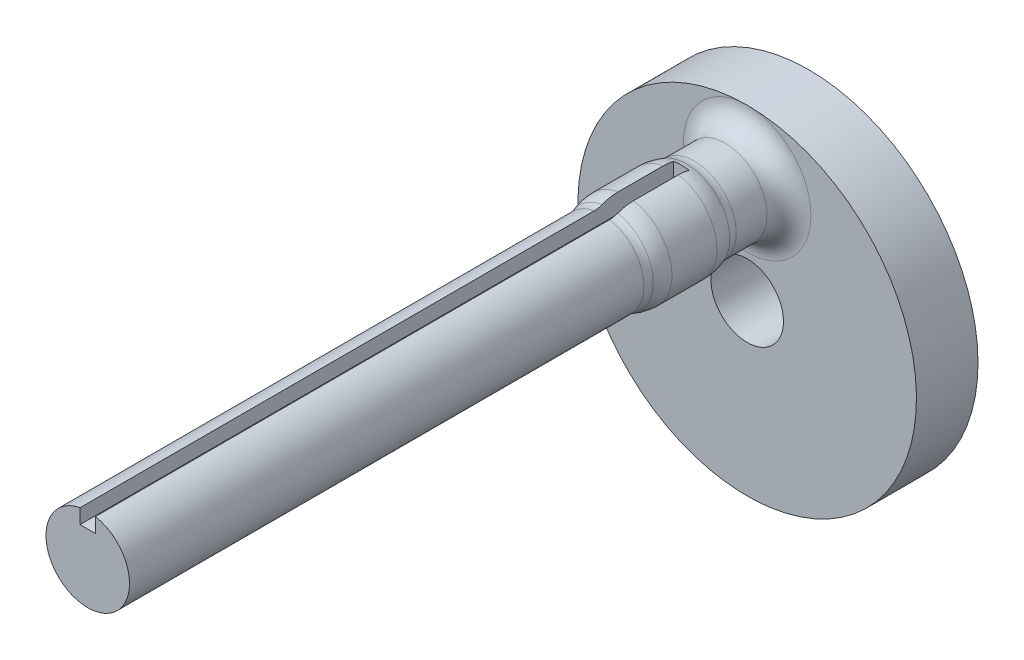
ISO-10303-21;
HEADER;
FILE_DESCRIPTION(('STEP AP214'),'2;1');
FILE_NAME('part.step','',(''),(''),'','','');
FILE_SCHEMA(('AUTOMOTIVE_DESIGN { 1 0 10303 214 1 1 1 1 }'));
ENDSEC;
DATA;
#1=APPLICATION_CONTEXT('core data for automotive mechanical design processes');
#2=APPLICATION_PROTOCOL_DEFINITION('international standard','automotive_design',2000,#1);
#3=PRODUCT_CONTEXT('',#1,'mechanical');
#4=PRODUCT('Part','Part','',(#3));
#5=PRODUCT_RELATED_PRODUCT_CATEGORY('part','',(#4));
#6=PRODUCT_DEFINITION_FORMATION('','',#4);
#7=PRODUCT_DEFINITION_CONTEXT('part definition',#1,'design');
#8=PRODUCT_DEFINITION('design','',#6,#7);
#9=PRODUCT_DEFINITION_SHAPE('','',#8);
#10=(LENGTH_UNIT() NAMED_UNIT(*) SI_UNIT(.MILLI.,.METRE.));
#11=(NAMED_UNIT(*) PLANE_ANGLE_UNIT() SI_UNIT($,.RADIAN.));
#12=(NAMED_UNIT(*) SI_UNIT($,.STERADIAN.) SOLID_ANGLE_UNIT());
#13=UNCERTAINTY_MEASURE_WITH_UNIT(LENGTH_MEASURE(1.E-05),#10,'distance_accuracy_value','');
#14=(GEOMETRIC_REPRESENTATION_CONTEXT(3) GLOBAL_UNCERTAINTY_ASSIGNED_CONTEXT((#13)) GLOBAL_UNIT_ASSIGNED_CONTEXT((#10,
#11,#12)) REPRESENTATION_CONTEXT('',''));
#15=CARTESIAN_POINT('',(0.,0.,0.));
#16=DIRECTION('',(0.,0.,1.));
#17=DIRECTION('',(1.,0.,0.));
#18=AXIS2_PLACEMENT_3D('',#15,#16,#17);
#19=CARTESIAN_POINT('',(0.,4.8,8.8));
#20=DIRECTION('',(0.,0.,-1.));
#21=DIRECTION('',(-1.,0.,0.));
#22=AXIS2_PLACEMENT_3D('',#19,#20,#21);
#23=CYLINDRICAL_SURFACE('',#22,2.1);
#24=DIRECTION('',(0.,0.,-1.));
#25=VECTOR('',#24,1.);
#26=CARTESIAN_POINT('',(-0.35,6.87062792408486,8.8));
#27=LINE('',#26,#25);
#28=CARTESIAN_POINT('',(-0.35,6.87062792408486,6.27703296142691));
#29=VERTEX_POINT('',#28);
#30=CARTESIAN_POINT('',(-0.35,6.87062792408487,8.3229670385731));
#31=VERTEX_POINT('',#30);
#32=EDGE_CURVE('E194',#29,#31,#27,.F.);
#33=ORIENTED_EDGE('',*,*,#32,.F.);
#34=CARTESIAN_POINT('',(0.,4.8,6.27703296142691));
#35=DIRECTION('',(0.,0.,-1.));
#36=DIRECTION('',(-1.,0.,0.));
#37=AXIS2_PLACEMENT_3D('',#34,#35,#36);
#38=CIRCLE('',#37,2.1);
#39=CARTESIAN_POINT('',(0.35,6.87062792408486,6.27703296142691));
#40=VERTEX_POINT('',#39);
#41=EDGE_CURVE('E219',#29,#40,#38,.F.);
#42=ORIENTED_EDGE('',*,*,#41,.T.);
#43=DIRECTION('',(0.,0.,-1.));
#44=VECTOR('',#43,1.);
#45=CARTESIAN_POINT('',(0.35,6.87062792408486,8.8));
#46=LINE('',#45,#44);
#47=CARTESIAN_POINT('',(0.35,6.87062792408487,8.3229670385731));
#48=VERTEX_POINT('',#47);
#49=EDGE_CURVE('E173',#48,#40,#46,.T.);
#50=ORIENTED_EDGE('',*,*,#49,.F.);
#51=CARTESIAN_POINT('',(0.,4.8,8.3229670385731));
#52=DIRECTION('',(0.,0.,-1.));
#53=DIRECTION('',(-1.,0.,0.));
#54=AXIS2_PLACEMENT_3D('',#51,#52,#53);
#55=CIRCLE('',#54,2.1);
#56=EDGE_CURVE('E224',#48,#31,#55,.T.);
#57=ORIENTED_EDGE('',*,*,#56,.T.);
#58=EDGE_LOOP('',(#33,#42,#50,#57));
#59=FACE_BOUND('',#58,.T.);
#60=ADVANCED_FACE('F35',(#59),#23,.T.);
#61=CARTESIAN_POINT('',(0.,4.8,32.8));
#62=DIRECTION('',(0.,0.,1.));
#63=DIRECTION('',(1.,0.,0.));
#64=AXIS2_PLACEMENT_3D('',#61,#62,#63);
#65=PLANE('',#64);
#66=DIRECTION('',(1.,0.,0.));
#67=VECTOR('',#66,1.);
#68=CARTESIAN_POINT('',(-0.35,6.,32.8));
#69=LINE('',#68,#67);
#70=CARTESIAN_POINT('',(-0.35,6.,32.8));
#71=VERTEX_POINT('',#70);
#72=CARTESIAN_POINT('',(0.35,6.,32.8));
#73=VERTEX_POINT('',#72);
#74=EDGE_CURVE('E113',#71,#73,#69,.T.);
#75=ORIENTED_EDGE('',*,*,#74,.F.);
#76=DIRECTION('',(0.,-1.,0.));
#77=VECTOR('',#76,1.);
#78=CARTESIAN_POINT('',(-0.35,6.,32.8));
#79=LINE('',#78,#77);
#80=CARTESIAN_POINT('',(-0.35,6.66748493969831,32.8));
#81=VERTEX_POINT('',#80);
#82=EDGE_CURVE('E102',#81,#71,#79,.T.);
#83=ORIENTED_EDGE('',*,*,#82,.F.);
#84=CARTESIAN_POINT('',(0.,4.8,32.8));
#85=DIRECTION('',(0.,0.,1.));
#86=DIRECTION('',(1.,0.,0.));
#87=AXIS2_PLACEMENT_3D('',#84,#85,#86);
#88=CIRCLE('',#87,1.9);
#89=CARTESIAN_POINT('',(0.35,6.66748493969831,32.8));
#90=VERTEX_POINT('',#89);
#91=EDGE_CURVE('E240',#81,#90,#88,.T.);
#92=ORIENTED_EDGE('',*,*,#91,.T.);
#93=DIRECTION('',(0.,1.,0.));
#94=VECTOR('',#93,1.);
#95=CARTESIAN_POINT('',(0.35,6.,32.8));
#96=LINE('',#95,#94);
#97=EDGE_CURVE('E126',#73,#90,#96,.T.);
#98=ORIENTED_EDGE('',*,*,#97,.F.);
#99=EDGE_LOOP('',(#75,#83,#92,#98));
#100=FACE_BOUND('',#99,.T.);
#101=ADVANCED_FACE('F125',(#100),#65,.T.);
#102=CARTESIAN_POINT('',(0.,4.8,32.8));
#103=DIRECTION('',(0.,0.,-1.));
#104=DIRECTION('',(-1.,0.,0.));
#105=AXIS2_PLACEMENT_3D('',#102,#103,#104);
#106=CYLINDRICAL_SURFACE('',#105,1.9);
#107=DIRECTION('',(0.,0.,-1.));
#108=VECTOR('',#107,1.);
#109=CARTESIAN_POINT('',(-0.35,6.66748493969831,32.8));
#110=LINE('',#109,#108);
#111=CARTESIAN_POINT('',(-0.35,6.66748493969831,9.4));
#112=VERTEX_POINT('',#111);
#113=EDGE_CURVE('E108',#112,#81,#110,.F.);
#114=ORIENTED_EDGE('',*,*,#113,.F.);
#115=CARTESIAN_POINT('',(0.,4.8,9.4));
#116=DIRECTION('',(0.,0.,-1.));
#117=DIRECTION('',(-1.,0.,0.));
#118=AXIS2_PLACEMENT_3D('',#115,#116,#117);
#119=CIRCLE('',#118,1.9);
#120=CARTESIAN_POINT('',(0.35,6.66748493969831,9.4));
#121=VERTEX_POINT('',#120);
#122=EDGE_CURVE('E226',#112,#121,#119,.F.);
#123=ORIENTED_EDGE('',*,*,#122,.T.);
#124=DIRECTION('',(0.,0.,-1.));
#125=VECTOR('',#124,1.);
#126=CARTESIAN_POINT('',(0.35,6.66748493969831,32.8));
#127=LINE('',#126,#125);
#128=EDGE_CURVE('E143',#90,#121,#127,.T.);
#129=ORIENTED_EDGE('',*,*,#128,.F.);
#130=ORIENTED_EDGE('',*,*,#91,.F.);
#131=EDGE_LOOP('',(#114,#123,#129,#130));
#132=FACE_BOUND('',#131,.T.);
#133=ADVANCED_FACE('F269',(#132),#106,.T.);
#134=CARTESIAN_POINT('',(0.,4.8,9.4));
#135=DIRECTION('',(0.,0.,-1.));
#136=DIRECTION('',(-1.,0.,0.));
#137=AXIS2_PLACEMENT_3D('',#134,#135,#136);
#138=TOROIDAL_SURFACE('',#137,2.9,1.);
#139=CARTESIAN_POINT('',(-0.35,7.6134283399473,8.40210722938284));
#140=CARTESIAN_POINT('',(-0.35,7.58486785313755,8.40395033658526));
#141=CARTESIAN_POINT('',(-0.35,7.55639913295343,8.40699986291284));
#142=CARTESIAN_POINT('',(-0.35,7.49982132915014,8.41548574715783));
#143=CARTESIAN_POINT('',(-0.35,7.47171222524689,8.42092196983773));
#144=CARTESIAN_POINT('',(-0.35,7.38826647448536,8.4407525048368));
#145=CARTESIAN_POINT('',(-0.35,7.33372535674719,8.45867433338937));
#146=CARTESIAN_POINT('',(-0.35,7.22842736942052,8.50341221066531));
#147=CARTESIAN_POINT('',(-0.35,7.17767209792604,8.5302319896872));
#148=CARTESIAN_POINT('',(-0.35,7.08139000991697,8.59201635124548));
#149=CARTESIAN_POINT('',(-0.35,7.03586222190808,8.62697941673464));
#150=CARTESIAN_POINT('',(-0.35,6.95140101046618,8.70404541231914));
#151=CARTESIAN_POINT('',(-0.35,6.91246077194508,8.74614087226823));
#152=CARTESIAN_POINT('',(-0.35,6.84227732362359,8.83633502519003));
#153=CARTESIAN_POINT('',(-0.35,6.81103486181069,8.88443430086562));
#154=CARTESIAN_POINT('',(-0.35,6.75750301964808,8.98476259072471));
#155=CARTESIAN_POINT('',(-0.35,6.73512700108953,9.03694535592299));
#156=CARTESIAN_POINT('',(-0.35,6.69960865119455,9.14435990641659));
#157=CARTESIAN_POINT('',(-0.35,6.68646474973651,9.19959117152423));
#158=CARTESIAN_POINT('',(-0.35,6.66997275366691,9.31064241021333));
#159=CARTESIAN_POINT('',(-0.35,6.66647960650495,9.36644086911687));
#160=CARTESIAN_POINT('',(-0.35,6.6689886636855,9.47782210948553));
#161=CARTESIAN_POINT('',(-0.35,6.67499037718531,9.53340490195076));
#162=CARTESIAN_POINT('',(-0.35,6.69620856203986,9.64234930658461));
#163=CARTESIAN_POINT('',(-0.35,6.71135625344969,9.69572435112632));
#164=CARTESIAN_POINT('',(-0.35,6.75033073979572,9.79921618465926));
#165=CARTESIAN_POINT('',(-0.35,6.77415936182405,9.84933228511544));
#166=CARTESIAN_POINT('',(-0.35,6.82999804601414,9.94533872542651));
#167=CARTESIAN_POINT('',(-0.35,6.86207593878932,9.99118951890459));
#168=CARTESIAN_POINT('',(-0.35,6.93336098763809,10.076931160482));
#169=CARTESIAN_POINT('',(-0.35,6.97256177101805,10.1168272784468));
#170=CARTESIAN_POINT('',(-0.35,7.03470785400514,10.1704408577819));
#171=CARTESIAN_POINT('',(-0.35,7.05535509628515,10.1868883974595));
#172=CARTESIAN_POINT('',(-0.35,7.09782624609708,10.2180966330458));
#173=CARTESIAN_POINT('',(-0.35,7.11964781489432,10.2328605114877));
#174=CARTESIAN_POINT('',(-0.35,7.14201933417898,10.24676167328));
#175=B_SPLINE_CURVE_WITH_KNOTS('',3,(#139,#140,#141,#142,#143,#144,#145,#146,#147,#148,#149,
#150,#151,#152,#153,#154,#155,#156,#157,#158,#159,#160,#161,#162,#163,#164,#165,#166,#167,#168,
#169,#170,#171,#172,#173,#174),.UNSPECIFIED.,.F.,.F.,(4,2,2,2,2,2,2,2,2,2,2,2,2,2,2,2,2,4),(0.,
0.0858066278935484,0.171608394348858,0.342956567628461,0.514376666373305,0.685764856050946,
0.85697463874072,1.02820105120837,1.19771043658446,1.36719098623045,1.53410998473162,
1.70102035453374,1.86669088580166,2.03239630622846,2.19951043561023,2.36647578131818,
2.44560047771062,2.5245730390221),.UNSPECIFIED.);
#176=CARTESIAN_POINT('',(-0.35,6.73527201648186,9.0409890128577));
#177=VERTEX_POINT('',#176);
#178=EDGE_CURVE('E172',#177,#112,#175,.T.);
#179=ORIENTED_EDGE('',*,*,#178,.F.);
#180=CARTESIAN_POINT('',(0.,4.8,9.0409890128577));
#181=DIRECTION('',(0.,0.,1.));
#182=DIRECTION('',(1.,0.,0.));
#183=AXIS2_PLACEMENT_3D('',#180,#181,#182);
#184=CIRCLE('',#183,1.96666666666667);
#185=CARTESIAN_POINT('',(0.35,6.73527201648186,9.0409890128577));
#186=VERTEX_POINT('',#185);
#187=EDGE_CURVE('E213',#177,#186,#184,.T.);
#188=ORIENTED_EDGE('',*,*,#187,.T.);
#189=CARTESIAN_POINT('',(0.35,7.14201933417901,10.24676167328));
#190=CARTESIAN_POINT('',(0.35,7.0938117081755,10.2168602475858));
#191=CARTESIAN_POINT('',(0.35,7.04815968806926,10.1828545736305));
#192=CARTESIAN_POINT('',(0.35,6.96315890789604,10.1077192911256));
#193=CARTESIAN_POINT('',(0.35,6.92380956502132,10.0665903419971));
#194=CARTESIAN_POINT('',(0.35,6.85257078159943,9.97825484136687));
#195=CARTESIAN_POINT('',(0.35,6.82068681894382,9.93104386617283));
#196=CARTESIAN_POINT('',(0.35,6.76540049019106,9.83191348258573));
#197=CARTESIAN_POINT('',(0.35,6.74199467043451,9.77999600223651));
#198=CARTESIAN_POINT('',(0.35,6.70459201791862,9.6734532319156));
#199=CARTESIAN_POINT('',(0.35,6.69050402463406,9.61885996536845));
#200=CARTESIAN_POINT('',(0.35,6.6718313709444,9.50806275013746));
#201=CARTESIAN_POINT('',(0.35,6.6672476018998,9.45185865088162));
#202=CARTESIAN_POINT('',(0.35,6.66773796140928,9.34025322820405));
#203=CARTESIAN_POINT('',(0.35,6.67268279803568,9.2848512914822));
#204=CARTESIAN_POINT('',(0.35,6.69181016666909,9.17567176755247));
#205=CARTESIAN_POINT('',(0.35,6.70599197643578,9.12189405369032));
#206=CARTESIAN_POINT('',(0.35,6.7431297868303,9.0174862285862));
#207=CARTESIAN_POINT('',(0.35,6.76608243935163,8.96685492482448));
#208=CARTESIAN_POINT('',(0.35,6.82005688346367,8.87009447724369));
#209=CARTESIAN_POINT('',(0.35,6.85107923455567,8.82396564590235));
#210=CARTESIAN_POINT('',(0.35,6.92072773407465,8.73688187260159));
#211=CARTESIAN_POINT('',(0.35,6.95944621860465,8.6960007983616));
#212=CARTESIAN_POINT('',(0.35,7.04312234205131,8.62120165415791));
#213=CARTESIAN_POINT('',(0.35,7.08808147146002,8.58728525242253));
#214=CARTESIAN_POINT('',(0.35,7.1836426077421,8.5269039277092));
#215=CARTESIAN_POINT('',(0.35,7.23431556142682,8.50055143020683));
#216=CARTESIAN_POINT('',(0.35,7.33932842320139,8.45669362485476));
#217=CARTESIAN_POINT('',(0.35,7.393664800576,8.4391799327409));
#218=CARTESIAN_POINT('',(0.35,7.4760679073091,8.42004986729659));
#219=CARTESIAN_POINT('',(0.35,7.50335431025327,8.41488423805092));
#220=CARTESIAN_POINT('',(0.35,7.55820826741219,8.40680730098732));
#221=CARTESIAN_POINT('',(0.35,7.5857752231204,8.40389192841884));
#222=CARTESIAN_POINT('',(0.35,7.61342833994721,8.40210722938278));
#223=B_SPLINE_CURVE_WITH_KNOTS('',3,(#189,#190,#191,#192,#193,#194,#195,#196,#197,#198,#199,
#200,#201,#202,#203,#204,#205,#206,#207,#208,#209,#210,#211,#212,#213,#214,#215,#216,#217,#218,
#219,#220,#221,#222),.UNSPECIFIED.,.F.,.F.,(4,2,2,2,2,2,2,2,2,2,2,2,2,2,2,2,4),(0.,
0.169976679225064,0.339937631643479,0.510022908632931,0.680038821494281,0.848365768968269,
1.01670850239225,1.18278309895699,1.34884471168283,1.51484299669219,1.68085279402993,
1.84898971584403,2.01716686416335,2.18772764210482,2.35812632493277,2.44135967259029,
2.52444231755724),.UNSPECIFIED.);
#224=EDGE_CURVE('E51',#121,#186,#223,.T.);
#225=ORIENTED_EDGE('',*,*,#224,.F.);
#226=ORIENTED_EDGE('',*,*,#122,.F.);
#227=EDGE_LOOP('',(#179,#188,#225,#226));
#228=FACE_BOUND('',#227,.T.);
#229=ADVANCED_FACE('F145',(#228),#138,.F.);
#230=CARTESIAN_POINT('',(0.,4.8,6.27703296142691));
#231=DIRECTION('',(0.,0.,-1.));
#232=DIRECTION('',(-1.,0.,0.));
#233=AXIS2_PLACEMENT_3D('',#230,#231,#232);
#234=DEGENERATE_TOROIDAL_SURFACE('',#233,0.1,2.,.T.);
#235=CARTESIAN_POINT('',(0.,4.8,5.5590109871423));
#236=DIRECTION('',(0.,0.,-1.));
#237=DIRECTION('',(-1.,0.,0.));
#238=AXIS2_PLACEMENT_3D('',#235,#236,#237);
#239=CIRCLE('',#238,1.96666666666667);
#240=CARTESIAN_POINT('',(-1.96666666666667,4.8,5.5590109871423));
#241=VERTEX_POINT('',#240);
#242=EDGE_CURVE('E215',#241,#241,#239,.T.);
#243=ORIENTED_EDGE('',*,*,#242,.F.);
#244=EDGE_LOOP('',(#243));
#245=FACE_BOUND('',#244,.T.);
#246=ORIENTED_EDGE('',*,*,#41,.F.);
#247=CARTESIAN_POINT('',(-0.35,6.58710468999593,7.29584007228355));
#248=CARTESIAN_POINT('',(-0.35,6.61350060317524,7.25208151643734));
#249=CARTESIAN_POINT('',(-0.35,6.63818565656168,7.20731380229578));
#250=CARTESIAN_POINT('',(-0.35,6.68400814928517,7.1160035414488));
#251=CARTESIAN_POINT('',(-0.35,6.70514592528353,7.06946116368641));
#252=CARTESIAN_POINT('',(-0.35,6.76302921839742,6.92759146915423));
#253=CARTESIAN_POINT('',(-0.35,6.79428245907492,6.82995889084019));
#254=CARTESIAN_POINT('',(-0.35,6.84329428720074,6.62253592377314));
#255=CARTESIAN_POINT('',(-0.35,6.85967016594624,6.51241986845746));
#256=CARTESIAN_POINT('',(-0.35,6.87369451192683,6.29101367896466));
#257=CARTESIAN_POINT('',(-0.35,6.8713456550646,6.17972371481782));
#258=CARTESIAN_POINT('',(-0.35,6.84799894395874,5.95918103341591));
#259=CARTESIAN_POINT('',(-0.35,6.8270112192785,5.84992724249622));
#260=CARTESIAN_POINT('',(-0.35,6.76697822425659,5.63643301641207));
#261=CARTESIAN_POINT('',(-0.35,6.72792380602331,5.53219515056583));
#262=CARTESIAN_POINT('',(-0.35,6.63285182535739,5.33168927033778));
#263=CARTESIAN_POINT('',(-0.35,6.57682070230817,5.23542770581729));
#264=CARTESIAN_POINT('',(-0.35,6.44944209600462,5.05378972787816));
#265=CARTESIAN_POINT('',(-0.35,6.37812299781973,4.9683936026836));
#266=CARTESIAN_POINT('',(-0.35,6.28162763791086,4.87080801303379));
#267=CARTESIAN_POINT('',(-0.35,6.26259457754279,4.85232251173714));
#268=CARTESIAN_POINT('',(-0.35,6.22382729033861,4.8161577548017));
#269=CARTESIAN_POINT('',(-0.35,6.20409408684482,4.79847740224724));
#270=CARTESIAN_POINT('',(-0.35,6.18400795256875,4.78119288914335));
#271=B_SPLINE_CURVE_WITH_KNOTS('',3,(#247,#248,#249,#250,#251,#252,#253,#254,#255,#256,#257,
#258,#259,#260,#261,#262,#263,#264,#265,#266,#267,#268,#269,#270),.UNSPECIFIED.,.F.,.F.,(4,2,2,
2,2,2,2,2,2,2,2,4),(0.,0.153232628867642,0.306450706657948,0.612669679681655,0.945077637948514,
1.27743809352077,1.60961803343605,1.94196635378757,2.27458084965729,2.60658305055801,
2.68616844958007,2.76564196450069),.UNSPECIFIED.);
#272=CARTESIAN_POINT('',(-0.35,6.81206235827332,5.8));
#273=VERTEX_POINT('',#272);
#274=EDGE_CURVE('E185',#29,#273,#271,.T.);
#275=ORIENTED_EDGE('',*,*,#274,.T.);
#276=CARTESIAN_POINT('',(0.,4.8,5.8));
#277=DIRECTION('',(0.,0.,-1.));
#278=DIRECTION('',(-1.,0.,0.));
#279=AXIS2_PLACEMENT_3D('',#276,#277,#278);
#280=CIRCLE('',#279,2.04227689934064);
#281=CARTESIAN_POINT('',(0.35,6.81206235827332,5.8));
#282=VERTEX_POINT('',#281);
#283=EDGE_CURVE('E11',#282,#273,#280,.F.);
#284=ORIENTED_EDGE('',*,*,#283,.F.);
#285=CARTESIAN_POINT('',(0.35,6.18400795256875,4.78119288914336));
#286=CARTESIAN_POINT('',(0.35,6.22614746238904,4.81745103990328));
#287=CARTESIAN_POINT('',(0.35,6.26673775323357,4.8554692642));
#288=CARTESIAN_POINT('',(0.35,6.34457256340475,4.93478586028427));
#289=CARTESIAN_POINT('',(0.35,6.38181720952193,4.9760841076563));
#290=CARTESIAN_POINT('',(0.35,6.48805891608879,5.1044134936002));
#291=CARTESIAN_POINT('',(0.35,6.55169290801013,5.19599060429121));
#292=CARTESIAN_POINT('',(0.35,6.66263705077983,5.38850287035783));
#293=CARTESIAN_POINT('',(0.35,6.70994521797058,5.48943916102491));
#294=CARTESIAN_POINT('',(0.35,6.78691225982629,5.6978079692957));
#295=CARTESIAN_POINT('',(0.35,6.81657694566811,5.80523833510943));
#296=CARTESIAN_POINT('',(0.35,6.85738978241507,6.02338840152456));
#297=CARTESIAN_POINT('',(0.35,6.86856568215218,6.13410291841336));
#298=CARTESIAN_POINT('',(0.35,6.87217006027056,6.35591318853035));
#299=CARTESIAN_POINT('',(0.35,6.86458646472884,6.46700914130591));
#300=CARTESIAN_POINT('',(0.35,6.83086755345534,6.68638533640059));
#301=CARTESIAN_POINT('',(0.35,6.80472357554384,6.79466423952573));
#302=CARTESIAN_POINT('',(0.35,6.73464741893329,7.0051097038899));
#303=CARTESIAN_POINT('',(0.35,6.6907544456855,7.10728917085608));
#304=CARTESIAN_POINT('',(0.35,6.62229655559126,7.23572164247491));
#305=CARTESIAN_POINT('',(0.35,6.60509442668521,7.26602839618184));
#306=CARTESIAN_POINT('',(0.35,6.58710468999593,7.29584007228355));
#307=B_SPLINE_CURVE_WITH_KNOTS('',3,(#285,#286,#287,#288,#289,#290,#291,#292,#293,#294,#295,
#296,#297,#298,#299,#300,#301,#302,#303,#304,#305,#306),.UNSPECIFIED.,.F.,.F.,(4,2,2,2,2,2,2,2,
2,2,4),(0.,0.166671842871717,0.333337366681229,0.666163368930388,0.9990297967375,
1.33178652859607,1.66404338905458,1.99651415118414,2.32914018039185,2.66103545655574,
2.76552695673651),.UNSPECIFIED.);
#308=EDGE_CURVE('E165',#282,#40,#307,.T.);
#309=ORIENTED_EDGE('',*,*,#308,.T.);
#310=EDGE_LOOP('',(#246,#275,#284,#309));
#311=FACE_BOUND('',#310,.T.);
#312=ADVANCED_FACE('F179',(#245,#311),#234,.T.);
#313=CARTESIAN_POINT('',(0.,4.8,8.3229670385731));
#314=DIRECTION('',(0.,0.,-1.));
#315=DIRECTION('',(-1.,0.,0.));
#316=AXIS2_PLACEMENT_3D('',#313,#314,#315);
#317=DEGENERATE_TOROIDAL_SURFACE('',#316,0.1,2.,.T.);
#318=ORIENTED_EDGE('',*,*,#187,.F.);
#319=CARTESIAN_POINT('',(-0.35,5.53101311178797,10.1925167488011));
#320=CARTESIAN_POINT('',(-0.35,5.58415971241488,10.1743095226513));
#321=CARTESIAN_POINT('',(-0.35,5.63653972458624,10.1538652192634));
#322=CARTESIAN_POINT('',(-0.35,5.73939574630932,10.1086443360065));
#323=CARTESIAN_POINT('',(-0.35,5.78987172515168,10.0838676862993));
#324=CARTESIAN_POINT('',(-0.35,5.8885228188798,10.0301378184467));
#325=CARTESIAN_POINT('',(-0.35,5.93669905466214,10.0011866632045));
#326=CARTESIAN_POINT('',(-0.35,6.03040980695104,9.93931450414673));
#327=CARTESIAN_POINT('',(-0.35,6.07594441241654,9.90639363412948));
#328=CARTESIAN_POINT('',(-0.35,6.20815186072421,9.80194052524642));
#329=CARTESIAN_POINT('',(-0.35,6.29043797553304,9.72471253054727));
#330=CARTESIAN_POINT('',(-0.35,6.44062547001274,9.55746598249189));
#331=CARTESIAN_POINT('',(-0.35,6.5085314054142,9.46745149512107));
#332=CARTESIAN_POINT('',(-0.35,6.6273993898888,9.2782484208505));
#333=CARTESIAN_POINT('',(-0.35,6.6785424449951,9.17917369583033));
#334=CARTESIAN_POINT('',(-0.35,6.76344420003705,8.973821319129));
#335=CARTESIAN_POINT('',(-0.35,6.79720040906701,8.86754263784833));
#336=CARTESIAN_POINT('',(-0.35,6.84631362324295,8.65100667330662));
#337=CARTESIAN_POINT('',(-0.35,6.86170180401751,8.54075645951777));
#338=CARTESIAN_POINT('',(-0.35,6.87374143409941,8.31922608066475));
#339=CARTESIAN_POINT('',(-0.35,6.87039152658793,8.20794584159926));
#340=CARTESIAN_POINT('',(-0.35,6.84505720616426,7.987539402591));
#341=CARTESIAN_POINT('',(-0.35,6.82307244029361,7.87841324348821));
#342=CARTESIAN_POINT('',(-0.35,6.76108507229434,7.66544895095683));
#343=CARTESIAN_POINT('',(-0.35,6.72109821053996,7.56160628593038));
#344=CARTESIAN_POINT('',(-0.35,6.64807803216635,7.41110255084256));
#345=CARTESIAN_POINT('',(-0.35,6.62123519993841,7.36135080258384));
#346=CARTESIAN_POINT('',(-0.35,6.56343883083291,7.26441878413443));
#347=CARTESIAN_POINT('',(-0.35,6.53249291734368,7.21723396856234));
#348=CARTESIAN_POINT('',(-0.35,6.49956767571306,7.17143930262839));
#349=B_SPLINE_CURVE_WITH_KNOTS('',3,(#319,#320,#321,#322,#323,#324,#325,#326,#327,#328,#329,
#330,#331,#332,#333,#334,#335,#336,#337,#338,#339,#340,#341,#342,#343,#344,#345,#346,#347,#348),
.UNSPECIFIED.,.F.,.F.,(4,2,2,2,2,2,2,2,2,2,2,2,2,2,4),(0.,0.168486291838551,0.3369752999621,
0.505381329917077,0.673781685371797,1.01054987789465,1.34721122001099,1.68010735457799,
2.01305116785495,2.34542907611806,2.67783105206767,3.01023932410522,3.342357513296,
3.51176998173718,3.68087198644201),.UNSPECIFIED.);
#350=EDGE_CURVE('E44',#177,#31,#349,.T.);
#351=ORIENTED_EDGE('',*,*,#350,.T.);
#352=ORIENTED_EDGE('',*,*,#56,.F.);
#353=CARTESIAN_POINT('',(0.35,6.49956767571306,7.17143930262839));
#354=CARTESIAN_POINT('',(0.35,6.55388582992514,7.24691993835596));
#355=CARTESIAN_POINT('',(0.35,6.60278572702138,7.32625621805148));
#356=CARTESIAN_POINT('',(0.35,6.68898607001747,7.49106067849564));
#357=CARTESIAN_POINT('',(0.35,6.72627950325586,7.5765325281465));
#358=CARTESIAN_POINT('',(0.35,6.79440966875773,7.76878931118725));
#359=CARTESIAN_POINT('',(0.35,6.82262789714732,7.87651328662853));
#360=CARTESIAN_POINT('',(0.35,6.86056680884174,8.09516127261763));
#361=CARTESIAN_POINT('',(0.35,6.87028596099678,8.20608554727967));
#362=CARTESIAN_POINT('',(0.35,6.870951865184,8.42792519349628));
#363=CARTESIAN_POINT('',(0.35,6.86191042823795,8.53884052671576));
#364=CARTESIAN_POINT('',(0.35,6.82533275848619,8.75758886976465));
#365=CARTESIAN_POINT('',(0.35,6.79779465167794,8.86542156612039));
#366=CARTESIAN_POINT('',(0.35,6.7250097700951,9.07492882656839));
#367=CARTESIAN_POINT('',(0.35,6.67976381396363,9.17660367509026));
#368=CARTESIAN_POINT('',(0.35,6.5728536761315,9.37091411474075));
#369=CARTESIAN_POINT('',(0.35,6.5111904735825,9.46355024450335));
#370=CARTESIAN_POINT('',(0.35,6.37316198529774,9.63723148703918));
#371=CARTESIAN_POINT('',(0.35,6.29678583748884,9.71826795864941));
#372=CARTESIAN_POINT('',(0.35,6.13153154439267,9.86638733229103));
#373=CARTESIAN_POINT('',(0.35,6.04265738602777,9.93347466731025));
#374=CARTESIAN_POINT('',(0.35,5.88335785183461,10.0339629608008));
#375=CARTESIAN_POINT('',(0.35,5.81545143679313,10.0714215082098));
#376=CARTESIAN_POINT('',(0.35,5.67585780563237,10.138166103166));
#377=CARTESIAN_POINT('',(0.35,5.60417635526462,10.1674642073335));
#378=CARTESIAN_POINT('',(0.35,5.53101311179722,10.1925167487979));
#379=B_SPLINE_CURVE_WITH_KNOTS('',3,(#353,#354,#355,#356,#357,#358,#359,#360,#361,#362,#363,
#364,#365,#366,#367,#368,#369,#370,#371,#372,#373,#374,#375,#376,#377,#378),.UNSPECIFIED.,.F.,
.F.,(4,2,2,2,2,2,2,2,2,2,2,2,4),(0.,0.278686849635967,0.55754175728945,0.889990904375527,
1.22246756674407,1.55473497674921,1.88703605572914,2.219321774071,2.55158767878199,
2.88409983090655,3.21650614975124,3.44866919275782,3.68048738544457),.UNSPECIFIED.);
#380=EDGE_CURVE('E158',#48,#186,#379,.T.);
#381=ORIENTED_EDGE('',*,*,#380,.T.);
#382=EDGE_LOOP('',(#318,#351,#352,#381));
#383=FACE_BOUND('',#382,.T.);
#384=ADVANCED_FACE('F37',(#383),#317,.T.);
#385=CARTESIAN_POINT('',(0.,4.8,5.2));
#386=DIRECTION('',(0.,0.,1.));
#387=DIRECTION('',(1.,0.,0.));
#388=AXIS2_PLACEMENT_3D('',#385,#386,#387);
#389=CIRCLE('',#388,1.9);
#390=CARTESIAN_POINT('',(1.9,4.8,5.2));
#391=VERTEX_POINT('',#390);
#392=EDGE_CURVE('E229',#391,#391,#389,.F.);
#393=ORIENTED_EDGE('',*,*,#392,.T.);
#394=EDGE_LOOP('',(#393));
#395=FACE_BOUND('',#394,.T.);
#396=CARTESIAN_POINT('',(0.,4.8,3.8));
#397=DIRECTION('',(0.,0.,1.));
#398=DIRECTION('',(1.,0.,0.));
#399=AXIS2_PLACEMENT_3D('',#396,#397,#398);
#400=CIRCLE('',#399,1.9);
#401=CARTESIAN_POINT('',(1.9,4.8,3.8));
#402=VERTEX_POINT('',#401);
#403=EDGE_CURVE('E233',#402,#402,#400,.T.);
#404=ORIENTED_EDGE('',*,*,#403,.T.);
#405=EDGE_LOOP('',(#404));
#406=FACE_BOUND('',#405,.T.);
#407=ADVANCED_FACE('F281',(#395,#406),#106,.T.);
#408=CARTESIAN_POINT('',(0.,0.,2.8));
#409=DIRECTION('',(0.,0.,-1.));
#410=DIRECTION('',(-1.,0.,0.));
#411=AXIS2_PLACEMENT_3D('',#408,#409,#410);
#412=CYLINDRICAL_SURFACE('',#411,7.7);
#413=CARTESIAN_POINT('',(0.,0.,2.8));
#414=DIRECTION('',(0.,0.,1.));
#415=DIRECTION('',(1.,0.,0.));
#416=AXIS2_PLACEMENT_3D('',#413,#414,#415);
#417=CIRCLE('',#416,7.7);
#418=CARTESIAN_POINT('',(0.,7.7,2.8));
#419=VERTEX_POINT('',#418);
#420=EDGE_CURVE('E236',#419,#419,#417,.T.);
#421=ORIENTED_EDGE('',*,*,#420,.F.);
#422=EDGE_LOOP('',(#421));
#423=FACE_BOUND('',#422,.T.);
#424=CARTESIAN_POINT('',(0.,0.,0.));
#425=DIRECTION('',(0.,0.,1.));
#426=DIRECTION('',(1.,0.,0.));
#427=AXIS2_PLACEMENT_3D('',#424,#425,#426);
#428=CIRCLE('',#427,7.7);
#429=CARTESIAN_POINT('',(7.7,0.,0.));
#430=VERTEX_POINT('',#429);
#431=EDGE_CURVE('E237',#430,#430,#428,.T.);
#432=ORIENTED_EDGE('',*,*,#431,.T.);
#433=EDGE_LOOP('',(#432));
#434=FACE_BOUND('',#433,.T.);
#435=ADVANCED_FACE('F286',(#423,#434),#412,.T.);
#436=CARTESIAN_POINT('',(0.,0.,2.8));
#437=DIRECTION('',(0.,0.,1.));
#438=DIRECTION('',(1.,0.,0.));
#439=AXIS2_PLACEMENT_3D('',#436,#437,#438);
#440=PLANE('',#439);
#441=CARTESIAN_POINT('',(0.,0.,2.8));
#442=DIRECTION('',(0.,0.,1.));
#443=DIRECTION('',(1.,0.,0.));
#444=AXIS2_PLACEMENT_3D('',#441,#442,#443);
#445=CIRCLE('',#444,1.65);
#446=CARTESIAN_POINT('',(1.65,0.,2.8));
#447=VERTEX_POINT('',#446);
#448=EDGE_CURVE('E193',#447,#447,#445,.T.);
#449=ORIENTED_EDGE('',*,*,#448,.F.);
#450=EDGE_LOOP('',(#449));
#451=FACE_BOUND('',#450,.T.);
#452=ORIENTED_EDGE('',*,*,#420,.T.);
#453=CARTESIAN_POINT('',(0.,4.8,2.8));
#454=DIRECTION('',(0.,0.,1.));
#455=DIRECTION('',(1.,0.,0.));
#456=AXIS2_PLACEMENT_3D('',#453,#454,#455);
#457=CIRCLE('',#456,2.9);
#458=EDGE_CURVE('E57',#419,#419,#457,.F.);
#459=ORIENTED_EDGE('',*,*,#458,.T.);
#460=EDGE_LOOP('',(#452,#459));
#461=FACE_BOUND('',#460,.T.);
#462=ADVANCED_FACE('F260',(#451,#461),#440,.T.);
#463=CARTESIAN_POINT('',(0.,0.,0.));
#464=DIRECTION('',(0.,0.,1.));
#465=DIRECTION('',(1.,0.,0.));
#466=AXIS2_PLACEMENT_3D('',#463,#464,#465);
#467=PLANE('',#466);
#468=CARTESIAN_POINT('',(0.,0.,0.));
#469=DIRECTION('',(0.,0.,1.));
#470=DIRECTION('',(1.,0.,0.));
#471=AXIS2_PLACEMENT_3D('',#468,#469,#470);
#472=CIRCLE('',#471,1.65);
#473=CARTESIAN_POINT('',(1.65,0.,0.));
#474=VERTEX_POINT('',#473);
#475=EDGE_CURVE('E195',#474,#474,#472,.T.);
#476=ORIENTED_EDGE('',*,*,#475,.T.);
#477=EDGE_LOOP('',(#476));
#478=FACE_BOUND('',#477,.T.);
#479=ORIENTED_EDGE('',*,*,#431,.F.);
#480=EDGE_LOOP('',(#479));
#481=FACE_BOUND('',#480,.T.);
#482=ADVANCED_FACE('F249',(#478,#481),#467,.F.);
#483=CARTESIAN_POINT('',(0.,0.,0.));
#484=DIRECTION('',(0.,0.,1.));
#485=DIRECTION('',(1.,0.,0.));
#486=AXIS2_PLACEMENT_3D('',#483,#484,#485);
#487=CYLINDRICAL_SURFACE('',#486,1.65);
#488=ORIENTED_EDGE('',*,*,#475,.F.);
#489=EDGE_LOOP('',(#488));
#490=FACE_BOUND('',#489,.T.);
#491=ORIENTED_EDGE('',*,*,#448,.T.);
#492=EDGE_LOOP('',(#491));
#493=FACE_BOUND('',#492,.T.);
#494=ADVANCED_FACE('F252',(#490,#493),#487,.F.);
#495=CARTESIAN_POINT('',(0.,4.8,3.8));
#496=DIRECTION('',(0.,0.,1.));
#497=DIRECTION('',(1.,0.,0.));
#498=AXIS2_PLACEMENT_3D('',#495,#496,#497);
#499=TOROIDAL_SURFACE('',#498,2.9,1.);
#500=ORIENTED_EDGE('',*,*,#458,.F.);
#501=EDGE_LOOP('',(#500));
#502=FACE_BOUND('',#501,.T.);
#503=ORIENTED_EDGE('',*,*,#403,.F.);
#504=EDGE_LOOP('',(#503));
#505=FACE_BOUND('',#504,.T.);
#506=ADVANCED_FACE('F254',(#502,#505),#499,.F.);
#507=CARTESIAN_POINT('',(0.,4.8,5.2));
#508=DIRECTION('',(0.,0.,1.));
#509=DIRECTION('',(1.,0.,0.));
#510=AXIS2_PLACEMENT_3D('',#507,#508,#509);
#511=TOROIDAL_SURFACE('',#510,2.9,1.);
#512=ORIENTED_EDGE('',*,*,#242,.T.);
#513=EDGE_LOOP('',(#512));
#514=FACE_BOUND('',#513,.T.);
#515=ORIENTED_EDGE('',*,*,#392,.F.);
#516=EDGE_LOOP('',(#515));
#517=FACE_BOUND('',#516,.T.);
#518=ADVANCED_FACE('F200',(#514,#517),#511,.F.);
#519=CARTESIAN_POINT('',(-0.35,6.,32.8));
#520=DIRECTION('',(1.,0.,0.));
#521=DIRECTION('',(0.,0.,-1.));
#522=AXIS2_PLACEMENT_3D('',#519,#520,#521);
#523=PLANE('',#522);
#524=ORIENTED_EDGE('',*,*,#32,.T.);
#525=ORIENTED_EDGE('',*,*,#350,.F.);
#526=ORIENTED_EDGE('',*,*,#178,.T.);
#527=ORIENTED_EDGE('',*,*,#113,.T.);
#528=ORIENTED_EDGE('',*,*,#82,.T.);
#529=DIRECTION('',(0.,0.,-1.));
#530=VECTOR('',#529,1.);
#531=CARTESIAN_POINT('',(-0.35,6.,32.8));
#532=LINE('',#531,#530);
#533=CARTESIAN_POINT('',(-0.35,6.,5.8));
#534=VERTEX_POINT('',#533);
#535=EDGE_CURVE('E106',#71,#534,#532,.T.);
#536=ORIENTED_EDGE('',*,*,#535,.T.);
#537=DIRECTION('',(0.,-1.,0.));
#538=VECTOR('',#537,1.);
#539=CARTESIAN_POINT('',(-0.35,6.,5.8));
#540=LINE('',#539,#538);
#541=EDGE_CURVE('E130',#273,#534,#540,.T.);
#542=ORIENTED_EDGE('',*,*,#541,.F.);
#543=ORIENTED_EDGE('',*,*,#274,.F.);
#544=EDGE_LOOP('',(#524,#525,#526,#527,#528,#536,#542,#543));
#545=FACE_BOUND('',#544,.T.);
#546=ADVANCED_FACE('F104',(#545),#523,.T.);
#547=CARTESIAN_POINT('',(-0.35,6.,32.8));
#548=DIRECTION('',(0.,1.,0.));
#549=DIRECTION('',(0.,0.,1.));
#550=AXIS2_PLACEMENT_3D('',#547,#548,#549);
#551=PLANE('',#550);
#552=DIRECTION('',(1.,0.,0.));
#553=VECTOR('',#552,1.);
#554=CARTESIAN_POINT('',(-0.35,6.,5.8));
#555=LINE('',#554,#553);
#556=CARTESIAN_POINT('',(0.35,6.,5.8));
#557=VERTEX_POINT('',#556);
#558=EDGE_CURVE('E121',#534,#557,#555,.T.);
#559=ORIENTED_EDGE('',*,*,#558,.F.);
#560=ORIENTED_EDGE('',*,*,#535,.F.);
#561=ORIENTED_EDGE('',*,*,#74,.T.);
#562=DIRECTION('',(0.,0.,-1.));
#563=VECTOR('',#562,1.);
#564=CARTESIAN_POINT('',(0.35,6.,32.8));
#565=LINE('',#564,#563);
#566=EDGE_CURVE('E122',#73,#557,#565,.T.);
#567=ORIENTED_EDGE('',*,*,#566,.T.);
#568=EDGE_LOOP('',(#559,#560,#561,#567));
#569=FACE_BOUND('',#568,.T.);
#570=ADVANCED_FACE('F118',(#569),#551,.T.);
#571=CARTESIAN_POINT('',(0.35,6.,32.8));
#572=DIRECTION('',(-1.,0.,0.));
#573=DIRECTION('',(0.,0.,1.));
#574=AXIS2_PLACEMENT_3D('',#571,#572,#573);
#575=PLANE('',#574);
#576=DIRECTION('',(0.,1.,0.));
#577=VECTOR('',#576,1.);
#578=CARTESIAN_POINT('',(0.35,6.,5.8));
#579=LINE('',#578,#577);
#580=EDGE_CURVE('E114',#557,#282,#579,.T.);
#581=ORIENTED_EDGE('',*,*,#580,.F.);
#582=ORIENTED_EDGE('',*,*,#566,.F.);
#583=ORIENTED_EDGE('',*,*,#97,.T.);
#584=ORIENTED_EDGE('',*,*,#128,.T.);
#585=ORIENTED_EDGE('',*,*,#224,.T.);
#586=ORIENTED_EDGE('',*,*,#380,.F.);
#587=ORIENTED_EDGE('',*,*,#49,.T.);
#588=ORIENTED_EDGE('',*,*,#308,.F.);
#589=EDGE_LOOP('',(#581,#582,#583,#584,#585,#586,#587,#588));
#590=FACE_BOUND('',#589,.T.);
#591=ADVANCED_FACE('F148',(#590),#575,.T.);
#592=CARTESIAN_POINT('',(0.,0.,5.8));
#593=DIRECTION('',(0.,0.,-1.));
#594=DIRECTION('',(-1.,0.,0.));
#595=AXIS2_PLACEMENT_3D('',#592,#593,#594);
#596=PLANE('',#595);
#597=ORIENTED_EDGE('',*,*,#283,.T.);
#598=ORIENTED_EDGE('',*,*,#541,.T.);
#599=ORIENTED_EDGE('',*,*,#558,.T.);
#600=ORIENTED_EDGE('',*,*,#580,.T.);
#601=EDGE_LOOP('',(#597,#598,#599,#600));
#602=FACE_BOUND('',#601,.T.);
#603=ADVANCED_FACE('F153',(#602),#596,.F.);
#604=CLOSED_SHELL('',(#60,#101,#133,#229,#312,#384,#407,#435,#462,#482,#494,#506,#518,#546,#570,
#591,#603));
#605=MANIFOLD_SOLID_BREP('B2',#604);
#606=ADVANCED_BREP_SHAPE_REPRESENTATION('',(#18,#605),#14);
#607=SHAPE_DEFINITION_REPRESENTATION(#9,#606);
ENDSEC;
END-ISO-10303-21;
